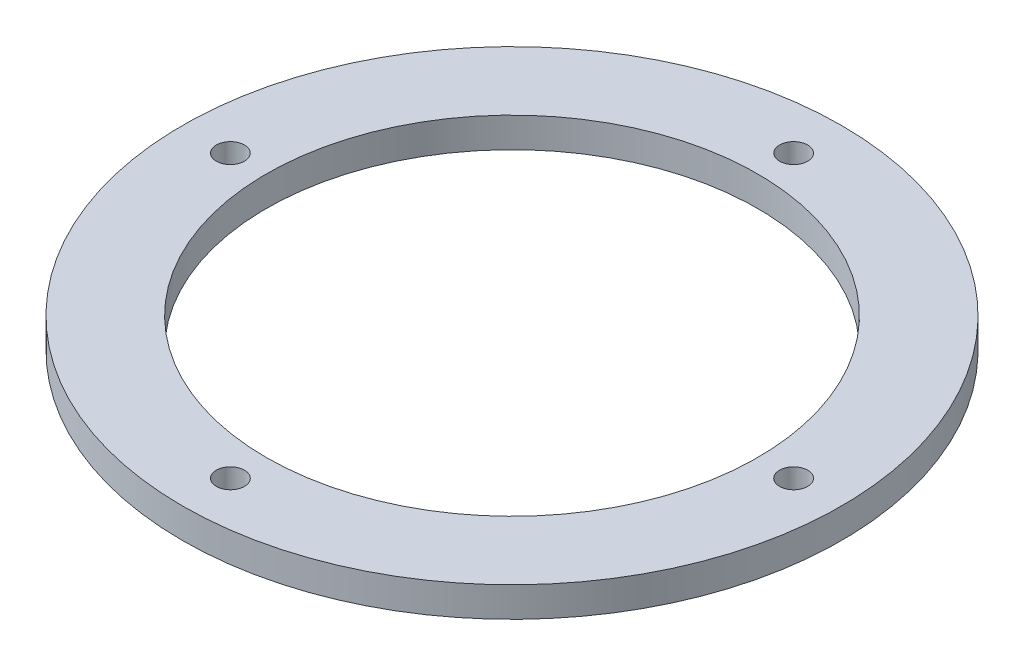
ISO-10303-21;
HEADER;
FILE_DESCRIPTION(('STEP AP214'),'2;1');
FILE_NAME('part.step','',(''),(''),'','','');
FILE_SCHEMA(('AUTOMOTIVE_DESIGN { 1 0 10303 214 1 1 1 1 }'));
ENDSEC;
DATA;
#1=APPLICATION_CONTEXT('core data for automotive mechanical design processes');
#2=APPLICATION_PROTOCOL_DEFINITION('international standard','automotive_design',2000,#1);
#3=PRODUCT_CONTEXT('',#1,'mechanical');
#4=PRODUCT('Part','Part','',(#3));
#5=PRODUCT_RELATED_PRODUCT_CATEGORY('part','',(#4));
#6=PRODUCT_DEFINITION_FORMATION('','',#4);
#7=PRODUCT_DEFINITION_CONTEXT('part definition',#1,'design');
#8=PRODUCT_DEFINITION('design','',#6,#7);
#9=PRODUCT_DEFINITION_SHAPE('','',#8);
#10=(LENGTH_UNIT() NAMED_UNIT(*) SI_UNIT(.MILLI.,.METRE.));
#11=(NAMED_UNIT(*) PLANE_ANGLE_UNIT() SI_UNIT($,.RADIAN.));
#12=(NAMED_UNIT(*) SI_UNIT($,.STERADIAN.) SOLID_ANGLE_UNIT());
#13=UNCERTAINTY_MEASURE_WITH_UNIT(LENGTH_MEASURE(1.E-05),#10,'distance_accuracy_value','');
#14=(GEOMETRIC_REPRESENTATION_CONTEXT(3) GLOBAL_UNCERTAINTY_ASSIGNED_CONTEXT((#13)) GLOBAL_UNIT_ASSIGNED_CONTEXT((#10,
#11,#12)) REPRESENTATION_CONTEXT('',''));
#15=CARTESIAN_POINT('',(0.,0.,0.));
#16=DIRECTION('',(0.,0.,1.));
#17=DIRECTION('',(1.,0.,0.));
#18=AXIS2_PLACEMENT_3D('',#15,#16,#17);
#19=CARTESIAN_POINT('',(0.,5.,0.));
#20=DIRECTION('',(0.,1.,0.));
#21=DIRECTION('',(0.,0.,1.));
#22=AXIS2_PLACEMENT_3D('',#19,#20,#21);
#23=PLANE('',#22);
#24=CARTESIAN_POINT('',(-1.64099622925627E-13,5.,47.));
#25=DIRECTION('',(0.,1.,0.));
#26=DIRECTION('',(0.,0.,1.));
#27=AXIS2_PLACEMENT_3D('',#24,#25,#26);
#28=CIRCLE('',#27,2.35);
#29=CARTESIAN_POINT('',(-1.64099622925627E-13,5.,49.35));
#30=VERTEX_POINT('',#29);
#31=EDGE_CURVE('E75',#30,#30,#28,.T.);
#32=ORIENTED_EDGE('',*,*,#31,.F.);
#33=EDGE_LOOP('',(#32));
#34=FACE_BOUND('',#33,.T.);
#35=CARTESIAN_POINT('',(4.92298868776882E-13,5.,-47.));
#36=DIRECTION('',(0.,1.,0.));
#37=DIRECTION('',(0.,0.,1.));
#38=AXIS2_PLACEMENT_3D('',#35,#36,#37);
#39=CIRCLE('',#38,2.35);
#40=CARTESIAN_POINT('',(4.92298868776882E-13,5.,-44.65));
#41=VERTEX_POINT('',#40);
#42=EDGE_CURVE('E84',#41,#41,#39,.T.);
#43=ORIENTED_EDGE('',*,*,#42,.F.);
#44=EDGE_LOOP('',(#43));
#45=FACE_BOUND('',#44,.T.);
#46=CARTESIAN_POINT('',(-47.,5.,-3.28199245851255E-13));
#47=DIRECTION('',(0.,1.,0.));
#48=DIRECTION('',(0.,0.,1.));
#49=AXIS2_PLACEMENT_3D('',#46,#47,#48);
#50=CIRCLE('',#49,2.35);
#51=CARTESIAN_POINT('',(-47.,5.,2.34999999999967));
#52=VERTEX_POINT('',#51);
#53=EDGE_CURVE('E81',#52,#52,#50,.T.);
#54=ORIENTED_EDGE('',*,*,#53,.F.);
#55=EDGE_LOOP('',(#54));
#56=FACE_BOUND('',#55,.T.);
#57=CARTESIAN_POINT('',(47.,5.,0.));
#58=DIRECTION('',(0.,1.,0.));
#59=DIRECTION('',(0.,0.,1.));
#60=AXIS2_PLACEMENT_3D('',#57,#58,#59);
#61=CIRCLE('',#60,2.35);
#62=CARTESIAN_POINT('',(47.,5.,2.35));
#63=VERTEX_POINT('',#62);
#64=EDGE_CURVE('E78',#63,#63,#61,.T.);
#65=ORIENTED_EDGE('',*,*,#64,.F.);
#66=EDGE_LOOP('',(#65));
#67=FACE_BOUND('',#66,.T.);
#68=CARTESIAN_POINT('',(0.,5.,0.));
#69=DIRECTION('',(0.,1.,0.));
#70=DIRECTION('',(0.,0.,1.));
#71=AXIS2_PLACEMENT_3D('',#68,#69,#70);
#72=CIRCLE('',#71,55.);
#73=CARTESIAN_POINT('',(0.,5.,55.));
#74=VERTEX_POINT('',#73);
#75=EDGE_CURVE('E65',#74,#74,#72,.T.);
#76=ORIENTED_EDGE('',*,*,#75,.T.);
#77=EDGE_LOOP('',(#76));
#78=FACE_BOUND('',#77,.T.);
#79=CARTESIAN_POINT('',(0.,5.,0.));
#80=DIRECTION('',(0.,1.,0.));
#81=DIRECTION('',(0.,0.,1.));
#82=AXIS2_PLACEMENT_3D('',#79,#80,#81);
#83=CIRCLE('',#82,41.);
#84=CARTESIAN_POINT('',(0.,5.,41.));
#85=VERTEX_POINT('',#84);
#86=EDGE_CURVE('E69',#85,#85,#83,.T.);
#87=ORIENTED_EDGE('',*,*,#86,.F.);
#88=EDGE_LOOP('',(#87));
#89=FACE_BOUND('',#88,.T.);
#90=ADVANCED_FACE('F33',(#34,#45,#56,#67,#78,#89),#23,.T.);
#91=CARTESIAN_POINT('',(0.,0.,0.));
#92=DIRECTION('',(0.,1.,0.));
#93=DIRECTION('',(0.,0.,1.));
#94=AXIS2_PLACEMENT_3D('',#91,#92,#93);
#95=PLANE('',#94);
#96=CARTESIAN_POINT('',(4.92298868776882E-13,0.,-47.));
#97=DIRECTION('',(0.,1.,0.));
#98=DIRECTION('',(0.,0.,1.));
#99=AXIS2_PLACEMENT_3D('',#96,#97,#98);
#100=CIRCLE('',#99,3.35);
#101=CARTESIAN_POINT('',(4.92298868776882E-13,0.,-43.65));
#102=VERTEX_POINT('',#101);
#103=EDGE_CURVE('E53',#102,#102,#100,.T.);
#104=ORIENTED_EDGE('',*,*,#103,.T.);
#105=EDGE_LOOP('',(#104));
#106=FACE_BOUND('',#105,.T.);
#107=CARTESIAN_POINT('',(47.,0.,0.));
#108=DIRECTION('',(0.,1.,0.));
#109=DIRECTION('',(0.,0.,1.));
#110=AXIS2_PLACEMENT_3D('',#107,#108,#109);
#111=CIRCLE('',#110,3.35);
#112=CARTESIAN_POINT('',(47.,0.,3.35));
#113=VERTEX_POINT('',#112);
#114=EDGE_CURVE('E56',#113,#113,#111,.T.);
#115=ORIENTED_EDGE('',*,*,#114,.T.);
#116=EDGE_LOOP('',(#115));
#117=FACE_BOUND('',#116,.T.);
#118=CARTESIAN_POINT('',(-1.64099622925627E-13,0.,47.));
#119=DIRECTION('',(0.,1.,0.));
#120=DIRECTION('',(0.,0.,1.));
#121=AXIS2_PLACEMENT_3D('',#118,#119,#120);
#122=CIRCLE('',#121,3.35);
#123=CARTESIAN_POINT('',(-1.64099622925627E-13,0.,50.35));
#124=VERTEX_POINT('',#123);
#125=EDGE_CURVE('E59',#124,#124,#122,.T.);
#126=ORIENTED_EDGE('',*,*,#125,.T.);
#127=EDGE_LOOP('',(#126));
#128=FACE_BOUND('',#127,.T.);
#129=CARTESIAN_POINT('',(-47.,0.,-3.28199245851255E-13));
#130=DIRECTION('',(0.,1.,0.));
#131=DIRECTION('',(0.,0.,1.));
#132=AXIS2_PLACEMENT_3D('',#129,#130,#131);
#133=CIRCLE('',#132,3.35);
#134=CARTESIAN_POINT('',(-47.,0.,3.34999999999967));
#135=VERTEX_POINT('',#134);
#136=EDGE_CURVE('E62',#135,#135,#133,.T.);
#137=ORIENTED_EDGE('',*,*,#136,.T.);
#138=EDGE_LOOP('',(#137));
#139=FACE_BOUND('',#138,.T.);
#140=CARTESIAN_POINT('',(0.,0.,0.));
#141=DIRECTION('',(0.,1.,0.));
#142=DIRECTION('',(0.,0.,1.));
#143=AXIS2_PLACEMENT_3D('',#140,#141,#142);
#144=CIRCLE('',#143,55.);
#145=CARTESIAN_POINT('',(0.,0.,55.));
#146=VERTEX_POINT('',#145);
#147=EDGE_CURVE('E66',#146,#146,#144,.T.);
#148=ORIENTED_EDGE('',*,*,#147,.F.);
#149=EDGE_LOOP('',(#148));
#150=FACE_BOUND('',#149,.T.);
#151=CARTESIAN_POINT('',(0.,0.,0.));
#152=DIRECTION('',(0.,1.,0.));
#153=DIRECTION('',(0.,0.,1.));
#154=AXIS2_PLACEMENT_3D('',#151,#152,#153);
#155=CIRCLE('',#154,41.);
#156=CARTESIAN_POINT('',(0.,0.,41.));
#157=VERTEX_POINT('',#156);
#158=EDGE_CURVE('E72',#157,#157,#155,.T.);
#159=ORIENTED_EDGE('',*,*,#158,.T.);
#160=EDGE_LOOP('',(#159));
#161=FACE_BOUND('',#160,.T.);
#162=ADVANCED_FACE('F94',(#106,#117,#128,#139,#150,#161),#95,.F.);
#163=CARTESIAN_POINT('',(0.,5.,0.));
#164=DIRECTION('',(0.,-1.,0.));
#165=DIRECTION('',(0.,0.,-1.));
#166=AXIS2_PLACEMENT_3D('',#163,#164,#165);
#167=CYLINDRICAL_SURFACE('',#166,55.);
#168=ORIENTED_EDGE('',*,*,#75,.F.);
#169=EDGE_LOOP('',(#168));
#170=FACE_BOUND('',#169,.T.);
#171=ORIENTED_EDGE('',*,*,#147,.T.);
#172=EDGE_LOOP('',(#171));
#173=FACE_BOUND('',#172,.T.);
#174=ADVANCED_FACE('F110',(#170,#173),#167,.T.);
#175=CARTESIAN_POINT('',(0.,5.,0.));
#176=DIRECTION('',(0.,-1.,0.));
#177=DIRECTION('',(0.,0.,-1.));
#178=AXIS2_PLACEMENT_3D('',#175,#176,#177);
#179=CYLINDRICAL_SURFACE('',#178,41.);
#180=ORIENTED_EDGE('',*,*,#86,.T.);
#181=EDGE_LOOP('',(#180));
#182=FACE_BOUND('',#181,.T.);
#183=ORIENTED_EDGE('',*,*,#158,.F.);
#184=EDGE_LOOP('',(#183));
#185=FACE_BOUND('',#184,.T.);
#186=ADVANCED_FACE('F106',(#182,#185),#179,.F.);
#187=CARTESIAN_POINT('',(47.,11.6468037431535,0.));
#188=DIRECTION('',(0.,-1.,0.));
#189=DIRECTION('',(0.,0.,-1.));
#190=AXIS2_PLACEMENT_3D('',#187,#188,#189);
#191=CYLINDRICAL_SURFACE('',#190,2.35);
#192=CARTESIAN_POINT('',(47.,1.,0.));
#193=DIRECTION('',(0.,1.,0.));
#194=DIRECTION('',(0.,0.,1.));
#195=AXIS2_PLACEMENT_3D('',#192,#193,#194);
#196=CIRCLE('',#195,2.35);
#197=CARTESIAN_POINT('',(47.,1.,2.35));
#198=VERTEX_POINT('',#197);
#199=EDGE_CURVE('E44',#198,#198,#196,.F.);
#200=ORIENTED_EDGE('',*,*,#199,.T.);
#201=EDGE_LOOP('',(#200));
#202=FACE_BOUND('',#201,.T.);
#203=ORIENTED_EDGE('',*,*,#64,.T.);
#204=EDGE_LOOP('',(#203));
#205=FACE_BOUND('',#204,.T.);
#206=ADVANCED_FACE('F109',(#202,#205),#191,.F.);
#207=CARTESIAN_POINT('',(-47.,11.6468037431535,-3.28199245851255E-13));
#208=DIRECTION('',(0.,-1.,0.));
#209=DIRECTION('',(0.,0.,-1.));
#210=AXIS2_PLACEMENT_3D('',#207,#208,#209);
#211=CYLINDRICAL_SURFACE('',#210,2.35);
#212=CARTESIAN_POINT('',(-47.,1.,-3.28199245851255E-13));
#213=DIRECTION('',(0.,1.,0.));
#214=DIRECTION('',(0.,0.,1.));
#215=AXIS2_PLACEMENT_3D('',#212,#213,#214);
#216=CIRCLE('',#215,2.35);
#217=CARTESIAN_POINT('',(-47.,1.,2.34999999999967));
#218=VERTEX_POINT('',#217);
#219=EDGE_CURVE('E10',#218,#218,#216,.F.);
#220=ORIENTED_EDGE('',*,*,#219,.T.);
#221=EDGE_LOOP('',(#220));
#222=FACE_BOUND('',#221,.T.);
#223=ORIENTED_EDGE('',*,*,#53,.T.);
#224=EDGE_LOOP('',(#223));
#225=FACE_BOUND('',#224,.T.);
#226=ADVANCED_FACE('F183',(#222,#225),#211,.F.);
#227=CARTESIAN_POINT('',(4.92298868776882E-13,11.6468037431535,-47.));
#228=DIRECTION('',(0.,-1.,0.));
#229=DIRECTION('',(0.,0.,-1.));
#230=AXIS2_PLACEMENT_3D('',#227,#228,#229);
#231=CYLINDRICAL_SURFACE('',#230,2.35);
#232=CARTESIAN_POINT('',(4.92298868776882E-13,1.,-47.));
#233=DIRECTION('',(0.,1.,0.));
#234=DIRECTION('',(0.,0.,1.));
#235=AXIS2_PLACEMENT_3D('',#232,#233,#234);
#236=CIRCLE('',#235,2.35);
#237=CARTESIAN_POINT('',(4.92298868776882E-13,1.,-44.65));
#238=VERTEX_POINT('',#237);
#239=EDGE_CURVE('E48',#238,#238,#236,.F.);
#240=ORIENTED_EDGE('',*,*,#239,.T.);
#241=EDGE_LOOP('',(#240));
#242=FACE_BOUND('',#241,.T.);
#243=ORIENTED_EDGE('',*,*,#42,.T.);
#244=EDGE_LOOP('',(#243));
#245=FACE_BOUND('',#244,.T.);
#246=ADVANCED_FACE('F174',(#242,#245),#231,.F.);
#247=CARTESIAN_POINT('',(-1.64099622925627E-13,11.6468037431535,47.));
#248=DIRECTION('',(0.,-1.,0.));
#249=DIRECTION('',(0.,0.,-1.));
#250=AXIS2_PLACEMENT_3D('',#247,#248,#249);
#251=CYLINDRICAL_SURFACE('',#250,2.35);
#252=CARTESIAN_POINT('',(-1.64099622925627E-13,1.,47.));
#253=DIRECTION('',(0.,1.,0.));
#254=DIRECTION('',(0.,0.,1.));
#255=AXIS2_PLACEMENT_3D('',#252,#253,#254);
#256=CIRCLE('',#255,2.35);
#257=CARTESIAN_POINT('',(-1.64099622925627E-13,1.,49.35));
#258=VERTEX_POINT('',#257);
#259=EDGE_CURVE('E40',#258,#258,#256,.F.);
#260=ORIENTED_EDGE('',*,*,#259,.T.);
#261=EDGE_LOOP('',(#260));
#262=FACE_BOUND('',#261,.T.);
#263=ORIENTED_EDGE('',*,*,#31,.T.);
#264=EDGE_LOOP('',(#263));
#265=FACE_BOUND('',#264,.T.);
#266=ADVANCED_FACE('F90',(#262,#265),#251,.F.);
#267=CARTESIAN_POINT('',(4.92298868776882E-13,1.,-47.));
#268=DIRECTION('',(0.,1.,0.));
#269=DIRECTION('',(0.,0.,1.));
#270=AXIS2_PLACEMENT_3D('',#267,#268,#269);
#271=TOROIDAL_SURFACE('',#270,3.35,1.);
#272=ORIENTED_EDGE('',*,*,#239,.F.);
#273=EDGE_LOOP('',(#272));
#274=FACE_BOUND('',#273,.T.);
#275=ORIENTED_EDGE('',*,*,#103,.F.);
#276=EDGE_LOOP('',(#275));
#277=FACE_BOUND('',#276,.T.);
#278=ADVANCED_FACE('F124',(#274,#277),#271,.T.);
#279=CARTESIAN_POINT('',(47.,1.,0.));
#280=DIRECTION('',(0.,1.,0.));
#281=DIRECTION('',(0.,0.,1.));
#282=AXIS2_PLACEMENT_3D('',#279,#280,#281);
#283=TOROIDAL_SURFACE('',#282,3.35,1.);
#284=ORIENTED_EDGE('',*,*,#199,.F.);
#285=EDGE_LOOP('',(#284));
#286=FACE_BOUND('',#285,.T.);
#287=ORIENTED_EDGE('',*,*,#114,.F.);
#288=EDGE_LOOP('',(#287));
#289=FACE_BOUND('',#288,.T.);
#290=ADVANCED_FACE('F127',(#286,#289),#283,.T.);
#291=CARTESIAN_POINT('',(-1.64099622925627E-13,1.,47.));
#292=DIRECTION('',(0.,1.,0.));
#293=DIRECTION('',(0.,0.,1.));
#294=AXIS2_PLACEMENT_3D('',#291,#292,#293);
#295=TOROIDAL_SURFACE('',#294,3.35,1.);
#296=ORIENTED_EDGE('',*,*,#259,.F.);
#297=EDGE_LOOP('',(#296));
#298=FACE_BOUND('',#297,.T.);
#299=ORIENTED_EDGE('',*,*,#125,.F.);
#300=EDGE_LOOP('',(#299));
#301=FACE_BOUND('',#300,.T.);
#302=ADVANCED_FACE('F130',(#298,#301),#295,.T.);
#303=CARTESIAN_POINT('',(-47.,1.,-3.28199245851255E-13));
#304=DIRECTION('',(0.,1.,0.));
#305=DIRECTION('',(0.,0.,1.));
#306=AXIS2_PLACEMENT_3D('',#303,#304,#305);
#307=TOROIDAL_SURFACE('',#306,3.35,1.);
#308=ORIENTED_EDGE('',*,*,#219,.F.);
#309=EDGE_LOOP('',(#308));
#310=FACE_BOUND('',#309,.T.);
#311=ORIENTED_EDGE('',*,*,#136,.F.);
#312=EDGE_LOOP('',(#311));
#313=FACE_BOUND('',#312,.T.);
#314=ADVANCED_FACE('F35',(#310,#313),#307,.T.);
#315=CLOSED_SHELL('',(#90,#162,#174,#186,#206,#226,#246,#266,#278,#290,#302,#314));
#316=MANIFOLD_SOLID_BREP('B2',#315);
#317=ADVANCED_BREP_SHAPE_REPRESENTATION('',(#18,#316),#14);
#318=SHAPE_DEFINITION_REPRESENTATION(#9,#317);
ENDSEC;
END-ISO-10303-21;
